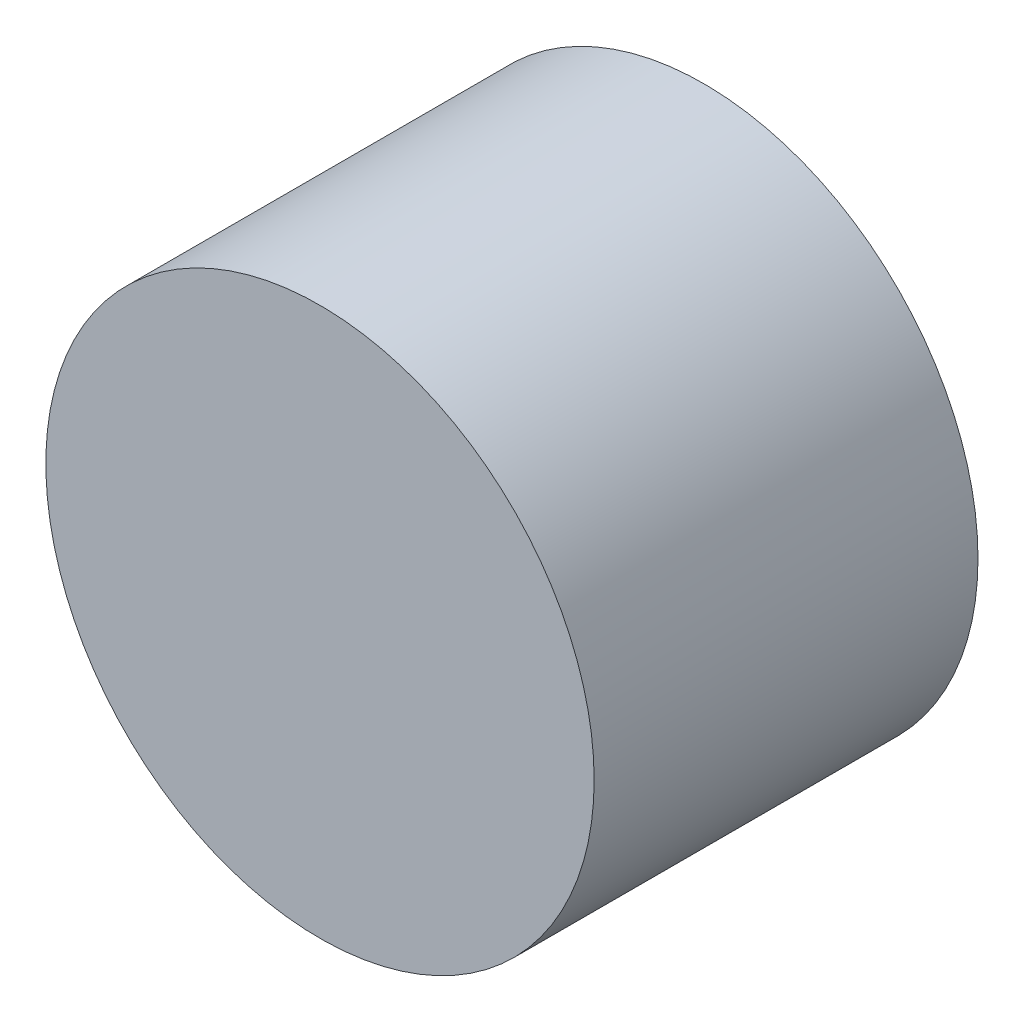
ISO-10303-21;
HEADER;
FILE_DESCRIPTION(('STEP AP214'),'2;1');
FILE_NAME('part.step','',(''),(''),'','','');
FILE_SCHEMA(('AUTOMOTIVE_DESIGN { 1 0 10303 214 1 1 1 1 }'));
ENDSEC;
DATA;
#1=APPLICATION_CONTEXT('core data for automotive mechanical design processes');
#2=APPLICATION_PROTOCOL_DEFINITION('international standard','automotive_design',2000,#1);
#3=PRODUCT_CONTEXT('',#1,'mechanical');
#4=PRODUCT('Part','Part','',(#3));
#5=PRODUCT_RELATED_PRODUCT_CATEGORY('part','',(#4));
#6=PRODUCT_DEFINITION_FORMATION('','',#4);
#7=PRODUCT_DEFINITION_CONTEXT('part definition',#1,'design');
#8=PRODUCT_DEFINITION('design','',#6,#7);
#9=PRODUCT_DEFINITION_SHAPE('','',#8);
#10=(LENGTH_UNIT() NAMED_UNIT(*) SI_UNIT(.MILLI.,.METRE.));
#11=(NAMED_UNIT(*) PLANE_ANGLE_UNIT() SI_UNIT($,.RADIAN.));
#12=(NAMED_UNIT(*) SI_UNIT($,.STERADIAN.) SOLID_ANGLE_UNIT());
#13=UNCERTAINTY_MEASURE_WITH_UNIT(LENGTH_MEASURE(1.E-05),#10,'distance_accuracy_value','');
#14=(GEOMETRIC_REPRESENTATION_CONTEXT(3) GLOBAL_UNCERTAINTY_ASSIGNED_CONTEXT((#13)) GLOBAL_UNIT_ASSIGNED_CONTEXT((#10,
#11,#12)) REPRESENTATION_CONTEXT('',''));
#15=CARTESIAN_POINT('',(0.,0.,0.));
#16=DIRECTION('',(0.,0.,1.));
#17=DIRECTION('',(1.,0.,0.));
#18=AXIS2_PLACEMENT_3D('',#15,#16,#17);
#19=CARTESIAN_POINT('',(0.,0.,28.));
#20=DIRECTION('',(0.,0.,-1.));
#21=DIRECTION('',(-1.,0.,0.));
#22=AXIS2_PLACEMENT_3D('',#19,#20,#21);
#23=CYLINDRICAL_SURFACE('',#22,20.);
#24=CARTESIAN_POINT('',(0.,0.,28.));
#25=DIRECTION('',(0.,0.,1.));
#26=DIRECTION('',(1.,0.,0.));
#27=AXIS2_PLACEMENT_3D('',#24,#25,#26);
#28=CIRCLE('',#27,20.);
#29=CARTESIAN_POINT('',(20.,0.,28.));
#30=VERTEX_POINT('',#29);
#31=EDGE_CURVE('E10',#30,#30,#28,.T.);
#32=ORIENTED_EDGE('',*,*,#31,.F.);
#33=EDGE_LOOP('',(#32));
#34=FACE_BOUND('',#33,.T.);
#35=CARTESIAN_POINT('',(0.,0.,0.));
#36=DIRECTION('',(0.,0.,1.));
#37=DIRECTION('',(1.,0.,0.));
#38=AXIS2_PLACEMENT_3D('',#35,#36,#37);
#39=CIRCLE('',#38,20.);
#40=CARTESIAN_POINT('',(20.,0.,0.));
#41=VERTEX_POINT('',#40);
#42=EDGE_CURVE('E45',#41,#41,#39,.T.);
#43=ORIENTED_EDGE('',*,*,#42,.T.);
#44=EDGE_LOOP('',(#43));
#45=FACE_BOUND('',#44,.T.);
#46=ADVANCED_FACE('F39',(#34,#45),#23,.T.);
#47=CARTESIAN_POINT('',(0.,0.,28.));
#48=DIRECTION('',(0.,0.,1.));
#49=DIRECTION('',(1.,0.,0.));
#50=AXIS2_PLACEMENT_3D('',#47,#48,#49);
#51=PLANE('',#50);
#52=ORIENTED_EDGE('',*,*,#31,.T.);
#53=EDGE_LOOP('',(#52));
#54=FACE_BOUND('',#53,.T.);
#55=ADVANCED_FACE('F53',(#54),#51,.T.);
#56=CARTESIAN_POINT('',(0.,0.,0.));
#57=DIRECTION('',(0.,0.,1.));
#58=DIRECTION('',(1.,0.,0.));
#59=AXIS2_PLACEMENT_3D('',#56,#57,#58);
#60=PLANE('',#59);
#61=ORIENTED_EDGE('',*,*,#42,.F.);
#62=EDGE_LOOP('',(#61));
#63=FACE_BOUND('',#62,.T.);
#64=ADVANCED_FACE('F55',(#63),#60,.F.);
#65=CLOSED_SHELL('',(#46,#55,#64));
#66=MANIFOLD_SOLID_BREP('B2',#65);
#67=ADVANCED_BREP_SHAPE_REPRESENTATION('',(#18,#66),#14);
#68=SHAPE_DEFINITION_REPRESENTATION(#9,#67);
ENDSEC;
END-ISO-10303-21;
